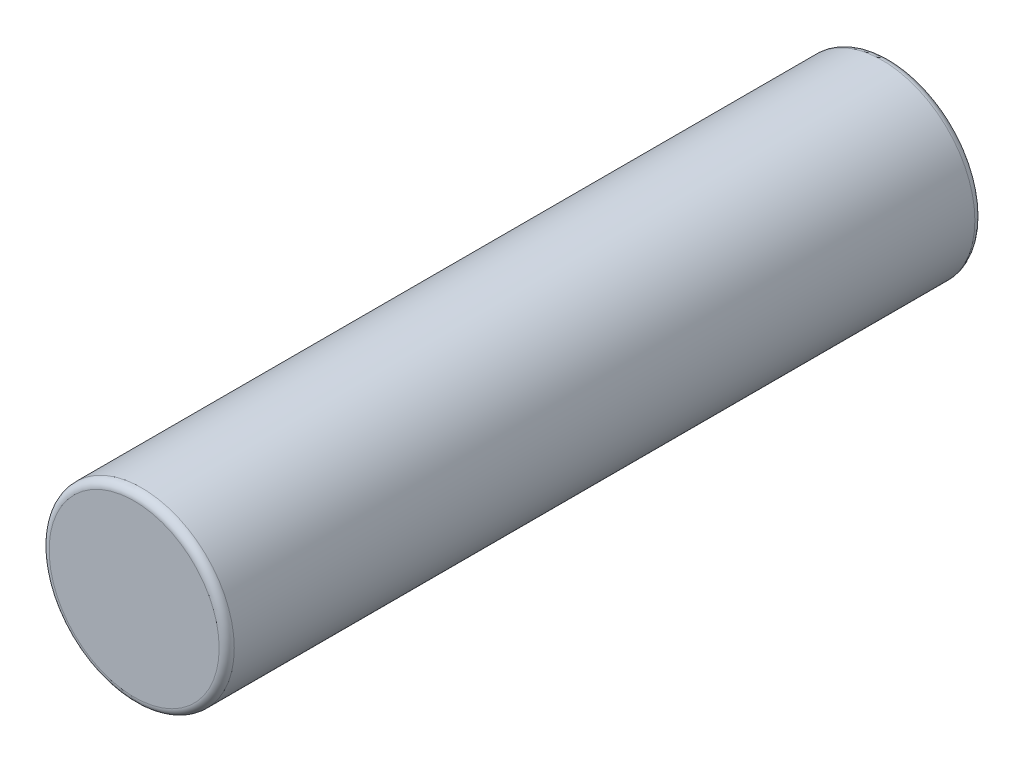
ISO-10303-21;
HEADER;
FILE_DESCRIPTION(('STEP AP214'),'2;1');
FILE_NAME('part.step','',(''),(''),'','','');
FILE_SCHEMA(('AUTOMOTIVE_DESIGN { 1 0 10303 214 1 1 1 1 }'));
ENDSEC;
DATA;
#1=APPLICATION_CONTEXT('core data for automotive mechanical design processes');
#2=APPLICATION_PROTOCOL_DEFINITION('international standard','automotive_design',2000,#1);
#3=PRODUCT_CONTEXT('',#1,'mechanical');
#4=PRODUCT('Part','Part','',(#3));
#5=PRODUCT_RELATED_PRODUCT_CATEGORY('part','',(#4));
#6=PRODUCT_DEFINITION_FORMATION('','',#4);
#7=PRODUCT_DEFINITION_CONTEXT('part definition',#1,'design');
#8=PRODUCT_DEFINITION('design','',#6,#7);
#9=PRODUCT_DEFINITION_SHAPE('','',#8);
#10=(LENGTH_UNIT() NAMED_UNIT(*) SI_UNIT(.MILLI.,.METRE.));
#11=(NAMED_UNIT(*) PLANE_ANGLE_UNIT() SI_UNIT($,.RADIAN.));
#12=(NAMED_UNIT(*) SI_UNIT($,.STERADIAN.) SOLID_ANGLE_UNIT());
#13=UNCERTAINTY_MEASURE_WITH_UNIT(LENGTH_MEASURE(1.E-05),#10,'distance_accuracy_value','');
#14=(GEOMETRIC_REPRESENTATION_CONTEXT(3) GLOBAL_UNCERTAINTY_ASSIGNED_CONTEXT((#13)) GLOBAL_UNIT_ASSIGNED_CONTEXT((#10,
#11,#12)) REPRESENTATION_CONTEXT('',''));
#15=CARTESIAN_POINT('',(0.,0.,0.));
#16=DIRECTION('',(0.,0.,1.));
#17=DIRECTION('',(1.,0.,0.));
#18=AXIS2_PLACEMENT_3D('',#15,#16,#17);
#19=CARTESIAN_POINT('',(0.,0.,20.));
#20=DIRECTION('',(0.,0.,-1.));
#21=DIRECTION('',(-1.,0.,0.));
#22=AXIS2_PLACEMENT_3D('',#19,#20,#21);
#23=CYLINDRICAL_SURFACE('',#22,2.45);
#24=CARTESIAN_POINT('',(0.,0.,0.199999999999999));
#25=DIRECTION('',(0.,0.,1.));
#26=DIRECTION('',(1.,0.,0.));
#27=AXIS2_PLACEMENT_3D('',#24,#25,#26);
#28=CIRCLE('',#27,2.45);
#29=CARTESIAN_POINT('',(2.45,0.,0.199999999999999));
#30=VERTEX_POINT('',#29);
#31=EDGE_CURVE('E49',#30,#30,#28,.T.);
#32=ORIENTED_EDGE('',*,*,#31,.T.);
#33=EDGE_LOOP('',(#32));
#34=FACE_BOUND('',#33,.T.);
#35=CARTESIAN_POINT('',(0.,0.,19.8));
#36=DIRECTION('',(0.,0.,1.));
#37=DIRECTION('',(1.,0.,0.));
#38=AXIS2_PLACEMENT_3D('',#35,#36,#37);
#39=CIRCLE('',#38,2.45);
#40=CARTESIAN_POINT('',(2.45,0.,19.8));
#41=VERTEX_POINT('',#40);
#42=EDGE_CURVE('E54',#41,#41,#39,.F.);
#43=ORIENTED_EDGE('',*,*,#42,.T.);
#44=EDGE_LOOP('',(#43));
#45=FACE_BOUND('',#44,.T.);
#46=ADVANCED_FACE('F35',(#34,#45),#23,.T.);
#47=CARTESIAN_POINT('',(0.,0.,20.));
#48=DIRECTION('',(0.,0.,1.));
#49=DIRECTION('',(1.,0.,0.));
#50=AXIS2_PLACEMENT_3D('',#47,#48,#49);
#51=PLANE('',#50);
#52=CARTESIAN_POINT('',(0.,0.,20.));
#53=DIRECTION('',(0.,0.,1.));
#54=DIRECTION('',(1.,0.,0.));
#55=AXIS2_PLACEMENT_3D('',#52,#53,#54);
#56=CIRCLE('',#55,2.25);
#57=CARTESIAN_POINT('',(2.25,0.,20.));
#58=VERTEX_POINT('',#57);
#59=EDGE_CURVE('E10',#58,#58,#56,.T.);
#60=ORIENTED_EDGE('',*,*,#59,.T.);
#61=EDGE_LOOP('',(#60));
#62=FACE_BOUND('',#61,.T.);
#63=ADVANCED_FACE('F70',(#62),#51,.T.);
#64=CARTESIAN_POINT('',(0.,0.,0.));
#65=DIRECTION('',(0.,0.,1.));
#66=DIRECTION('',(1.,0.,0.));
#67=AXIS2_PLACEMENT_3D('',#64,#65,#66);
#68=PLANE('',#67);
#69=CARTESIAN_POINT('',(0.,0.,0.));
#70=DIRECTION('',(0.,0.,1.));
#71=DIRECTION('',(1.,0.,0.));
#72=AXIS2_PLACEMENT_3D('',#69,#70,#71);
#73=CIRCLE('',#72,2.25);
#74=CARTESIAN_POINT('',(2.25,0.,0.));
#75=VERTEX_POINT('',#74);
#76=EDGE_CURVE('E43',#75,#75,#73,.F.);
#77=ORIENTED_EDGE('',*,*,#76,.T.);
#78=EDGE_LOOP('',(#77));
#79=FACE_BOUND('',#78,.T.);
#80=ADVANCED_FACE('F67',(#79),#68,.F.);
#81=CARTESIAN_POINT('',(0.,0.,0.199999999999999));
#82=DIRECTION('',(0.,0.,1.));
#83=DIRECTION('',(1.,0.,0.));
#84=AXIS2_PLACEMENT_3D('',#81,#82,#83);
#85=TOROIDAL_SURFACE('',#84,2.25,0.2);
#86=ORIENTED_EDGE('',*,*,#76,.F.);
#87=EDGE_LOOP('',(#86));
#88=FACE_BOUND('',#87,.T.);
#89=ORIENTED_EDGE('',*,*,#31,.F.);
#90=EDGE_LOOP('',(#89));
#91=FACE_BOUND('',#90,.T.);
#92=ADVANCED_FACE('F63',(#88,#91),#85,.T.);
#93=CARTESIAN_POINT('',(0.,0.,19.8));
#94=DIRECTION('',(0.,0.,1.));
#95=DIRECTION('',(1.,0.,0.));
#96=AXIS2_PLACEMENT_3D('',#93,#94,#95);
#97=TOROIDAL_SURFACE('',#96,2.25,0.2);
#98=ORIENTED_EDGE('',*,*,#42,.F.);
#99=EDGE_LOOP('',(#98));
#100=FACE_BOUND('',#99,.T.);
#101=ORIENTED_EDGE('',*,*,#59,.F.);
#102=EDGE_LOOP('',(#101));
#103=FACE_BOUND('',#102,.T.);
#104=ADVANCED_FACE('F37',(#100,#103),#97,.T.);
#105=CLOSED_SHELL('',(#46,#63,#80,#92,#104));
#106=MANIFOLD_SOLID_BREP('B2',#105);
#107=ADVANCED_BREP_SHAPE_REPRESENTATION('',(#18,#106),#14);
#108=SHAPE_DEFINITION_REPRESENTATION(#9,#107);
ENDSEC;
END-ISO-10303-21;
